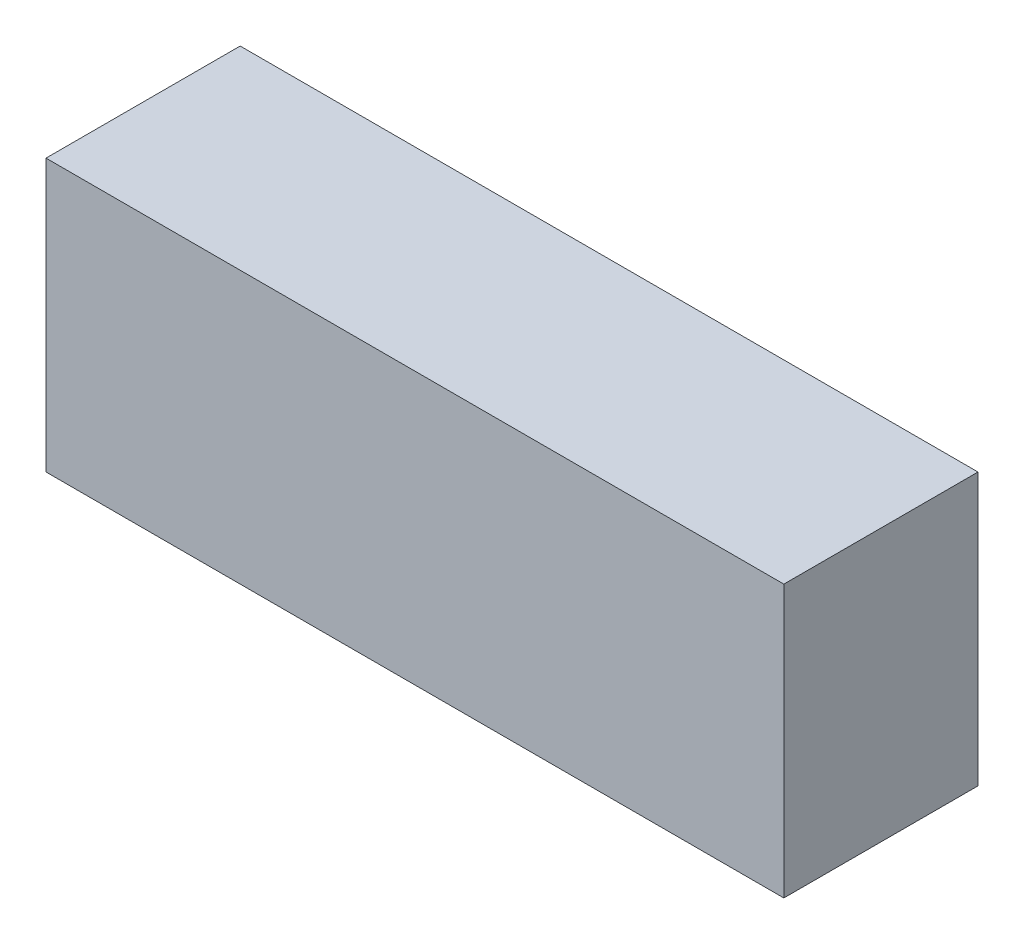
ISO-10303-21;
HEADER;
FILE_DESCRIPTION(('STEP AP214'),'2;1');
FILE_NAME('part.step','',(''),(''),'','','');
FILE_SCHEMA(('AUTOMOTIVE_DESIGN { 1 0 10303 214 1 1 1 1 }'));
ENDSEC;
DATA;
#1=APPLICATION_CONTEXT('core data for automotive mechanical design processes');
#2=APPLICATION_PROTOCOL_DEFINITION('international standard','automotive_design',2000,#1);
#3=PRODUCT_CONTEXT('',#1,'mechanical');
#4=PRODUCT('Part','Part','',(#3));
#5=PRODUCT_RELATED_PRODUCT_CATEGORY('part','',(#4));
#6=PRODUCT_DEFINITION_FORMATION('','',#4);
#7=PRODUCT_DEFINITION_CONTEXT('part definition',#1,'design');
#8=PRODUCT_DEFINITION('design','',#6,#7);
#9=PRODUCT_DEFINITION_SHAPE('','',#8);
#10=(LENGTH_UNIT() NAMED_UNIT(*) SI_UNIT(.MILLI.,.METRE.));
#11=(NAMED_UNIT(*) PLANE_ANGLE_UNIT() SI_UNIT($,.RADIAN.));
#12=(NAMED_UNIT(*) SI_UNIT($,.STERADIAN.) SOLID_ANGLE_UNIT());
#13=UNCERTAINTY_MEASURE_WITH_UNIT(LENGTH_MEASURE(1.E-05),#10,'distance_accuracy_value','');
#14=(GEOMETRIC_REPRESENTATION_CONTEXT(3) GLOBAL_UNCERTAINTY_ASSIGNED_CONTEXT((#13)) GLOBAL_UNIT_ASSIGNED_CONTEXT((#10,
#11,#12)) REPRESENTATION_CONTEXT('',''));
#15=CARTESIAN_POINT('',(0.,0.,0.));
#16=DIRECTION('',(0.,0.,1.));
#17=DIRECTION('',(1.,0.,0.));
#18=AXIS2_PLACEMENT_3D('',#15,#16,#17);
#19=CARTESIAN_POINT('',(0.,0.,0.));
#20=DIRECTION('',(0.,0.,1.));
#21=DIRECTION('',(1.,0.,0.));
#22=AXIS2_PLACEMENT_3D('',#19,#20,#21);
#23=PLANE('',#22);
#24=DIRECTION('',(0.,-1.,0.));
#25=VECTOR('',#24,1.);
#26=CARTESIAN_POINT('',(0.,0.,0.));
#27=LINE('',#26,#25);
#28=CARTESIAN_POINT('',(0.,0.,0.));
#29=VERTEX_POINT('',#28);
#30=CARTESIAN_POINT('',(0.,-700.,0.));
#31=VERTEX_POINT('',#30);
#32=EDGE_CURVE('E278',#29,#31,#27,.T.);
#33=ORIENTED_EDGE('',*,*,#32,.F.);
#34=DIRECTION('',(-1.,0.,0.));
#35=VECTOR('',#34,1.);
#36=CARTESIAN_POINT('',(0.,0.,0.));
#37=LINE('',#36,#35);
#38=CARTESIAN_POINT('',(1900.,2.32682891837997E-13,0.));
#39=VERTEX_POINT('',#38);
#40=EDGE_CURVE('E83',#39,#29,#37,.T.);
#41=ORIENTED_EDGE('',*,*,#40,.F.);
#42=DIRECTION('',(0.,1.,0.));
#43=VECTOR('',#42,1.);
#44=CARTESIAN_POINT('',(1900.,2.32682891837997E-13,0.));
#45=LINE('',#44,#43);
#46=CARTESIAN_POINT('',(1900.,-700.,0.));
#47=VERTEX_POINT('',#46);
#48=EDGE_CURVE('E283',#47,#39,#45,.T.);
#49=ORIENTED_EDGE('',*,*,#48,.F.);
#50=DIRECTION('',(1.,0.,0.));
#51=VECTOR('',#50,1.);
#52=CARTESIAN_POINT('',(0.,-700.,0.));
#53=LINE('',#52,#51);
#54=EDGE_CURVE('E281',#31,#47,#53,.T.);
#55=ORIENTED_EDGE('',*,*,#54,.F.);
#56=EDGE_LOOP('',(#33,#41,#49,#55));
#57=FACE_BOUND('',#56,.T.);
#58=DIRECTION('',(-0.866025403784438,0.500000000000001,0.));
#59=VECTOR('',#58,1.);
#60=CARTESIAN_POINT('',(12.5474196215564,21.7327682884223,0.));
#61=LINE('',#60,#59);
#62=CARTESIAN_POINT('',(477.0922463406,-246.472312468466,0.));
#63=VERTEX_POINT('',#62);
#64=CARTESIAN_POINT('',(412.140341056767,-208.972312468466,0.));
#65=VERTEX_POINT('',#64);
#66=EDGE_CURVE('E11',#63,#65,#61,.T.);
#67=ORIENTED_EDGE('',*,*,#66,.F.);
#68=CARTESIAN_POINT('',(477.0922463406,-246.472312468466,0.));
#69=CARTESIAN_POINT('',(477.824289258308,-246.894957644063,0.));
#70=CARTESIAN_POINT('',(479.288375093724,-247.740247995257,0.));
#71=CARTESIAN_POINT('',(481.552545630475,-248.863428405583,0.));
#72=CARTESIAN_POINT('',(483.952799734478,-249.697098582978,0.));
#73=CARTESIAN_POINT('',(485.689052704399,-249.963368468311,0.));
#74=CARTESIAN_POINT('',(486.602540378444,-250.,0.));
#75=B_SPLINE_CURVE_WITH_KNOTS('',3,(#68,#69,#70,#71,#72,#73,#74),.UNSPECIFIED.,.F.,.F.,(4,1,1,1,
4),(0.,0.25,0.5,0.75,1.),.UNSPECIFIED.);
#76=CARTESIAN_POINT('',(486.602540378444,-250.,0.));
#77=VERTEX_POINT('',#76);
#78=EDGE_CURVE('E127',#77,#63,#75,.F.);
#79=ORIENTED_EDGE('',*,*,#78,.F.);
#80=CARTESIAN_POINT('',(478.792326340599,-243.527687531534,0.));
#81=CARTESIAN_POINT('',(479.524369258308,-243.950332707131,0.));
#82=CARTESIAN_POINT('',(480.988455093724,-244.795623058326,0.));
#83=CARTESIAN_POINT('',(483.093243130475,-246.194862056489,0.));
#84=CARTESIAN_POINT('',(485.015349734478,-247.856707997396,0.));
#85=CARTESIAN_POINT('',(486.114072704399,-249.227212234078,0.));
#86=CARTESIAN_POINT('',(486.602540378444,-250.,0.));
#87=B_SPLINE_CURVE_WITH_KNOTS('',3,(#80,#81,#82,#83,#84,#85,#86),.UNSPECIFIED.,.F.,.F.,(4,1,1,1,
4),(0.,0.25,0.5,0.75,1.),.UNSPECIFIED.);
#88=CARTESIAN_POINT('',(478.792326340599,-243.527687531534,0.));
#89=VERTEX_POINT('',#88);
#90=EDGE_CURVE('E142',#77,#89,#87,.F.);
#91=ORIENTED_EDGE('',*,*,#90,.T.);
#92=DIRECTION('',(0.866025403784438,-0.500000000000001,0.));
#93=VECTOR('',#92,1.);
#94=CARTESIAN_POINT('',(14.2474996215564,24.677393225354,0.));
#95=LINE('',#94,#93);
#96=CARTESIAN_POINT('',(413.840421056767,-206.027687531534,0.));
#97=VERTEX_POINT('',#96);
#98=EDGE_CURVE('E46',#97,#89,#95,.T.);
#99=ORIENTED_EDGE('',*,*,#98,.F.);
#100=CARTESIAN_POINT('',(413.840421056767,-206.027687531534,0.));
#101=CARTESIAN_POINT('',(413.622528560335,-205.901887240065,0.));
#102=CARTESIAN_POINT('',(409.264678631696,-203.385881410677,0.));
#103=CARTESIAN_POINT('',(400.724202629113,-198.745644251402,0.));
#104=CARTESIAN_POINT('',(400.,-200.,0.));
#105=B_SPLINE_CURVE_WITH_KNOTS('',3,(#100,#101,#102,#103,#104),.UNSPECIFIED.,.F.,.F.,(4,1,4),
(0.,0.0500000000000003,1.),.UNSPECIFIED.);
#106=CARTESIAN_POINT('',(400.,-200.,0.));
#107=VERTEX_POINT('',#106);
#108=EDGE_CURVE('E131',#97,#107,#105,.T.);
#109=ORIENTED_EDGE('',*,*,#108,.T.);
#110=CARTESIAN_POINT('',(412.140341056767,-208.972312468466,0.));
#111=CARTESIAN_POINT('',(411.922448560335,-208.846512176996,0.));
#112=CARTESIAN_POINT('',(407.564598631696,-206.330506347609,0.));
#113=CARTESIAN_POINT('',(399.275797370888,-201.254355748598,0.));
#114=CARTESIAN_POINT('',(400.,-200.,0.));
#115=B_SPLINE_CURVE_WITH_KNOTS('',3,(#110,#111,#112,#113,#114),.UNSPECIFIED.,.F.,.F.,(4,1,4),
(0.,0.0500000000000003,1.),.UNSPECIFIED.);
#116=EDGE_CURVE('E116',#65,#107,#115,.T.);
#117=ORIENTED_EDGE('',*,*,#116,.F.);
#118=EDGE_LOOP('',(#67,#79,#91,#99,#109,#117));
#119=FACE_BOUND('',#118,.T.);
#120=ADVANCED_FACE('F37',(#57,#119),#23,.F.);
#121=CARTESIAN_POINT('',(0.,0.,500.));
#122=DIRECTION('',(1.,0.,0.));
#123=DIRECTION('',(0.,0.,-1.));
#124=AXIS2_PLACEMENT_3D('',#121,#122,#123);
#125=PLANE('',#124);
#126=ORIENTED_EDGE('',*,*,#32,.T.);
#127=DIRECTION('',(0.,0.,-1.));
#128=VECTOR('',#127,1.);
#129=CARTESIAN_POINT('',(0.,-700.,500.));
#130=LINE('',#129,#128);
#131=CARTESIAN_POINT('',(0.,-700.,500.));
#132=VERTEX_POINT('',#131);
#133=EDGE_CURVE('E292',#132,#31,#130,.T.);
#134=ORIENTED_EDGE('',*,*,#133,.F.);
#135=DIRECTION('',(0.,-1.,0.));
#136=VECTOR('',#135,1.);
#137=CARTESIAN_POINT('',(0.,0.,500.));
#138=LINE('',#137,#136);
#139=CARTESIAN_POINT('',(0.,0.,500.));
#140=VERTEX_POINT('',#139);
#141=EDGE_CURVE('E271',#140,#132,#138,.T.);
#142=ORIENTED_EDGE('',*,*,#141,.F.);
#143=DIRECTION('',(0.,0.,-1.));
#144=VECTOR('',#143,1.);
#145=CARTESIAN_POINT('',(0.,0.,500.));
#146=LINE('',#145,#144);
#147=EDGE_CURVE('E277',#140,#29,#146,.T.);
#148=ORIENTED_EDGE('',*,*,#147,.T.);
#149=EDGE_LOOP('',(#126,#134,#142,#148));
#150=FACE_BOUND('',#149,.T.);
#151=ADVANCED_FACE('F39',(#150),#125,.F.);
#152=CARTESIAN_POINT('',(0.,-700.,500.));
#153=DIRECTION('',(0.,1.,0.));
#154=DIRECTION('',(-1.,0.,0.));
#155=AXIS2_PLACEMENT_3D('',#152,#153,#154);
#156=PLANE('',#155);
#157=ORIENTED_EDGE('',*,*,#54,.T.);
#158=DIRECTION('',(0.,0.,-1.));
#159=VECTOR('',#158,1.);
#160=CARTESIAN_POINT('',(1900.,-700.,500.));
#161=LINE('',#160,#159);
#162=CARTESIAN_POINT('',(1900.,-700.,500.));
#163=VERTEX_POINT('',#162);
#164=EDGE_CURVE('E289',#163,#47,#161,.T.);
#165=ORIENTED_EDGE('',*,*,#164,.F.);
#166=DIRECTION('',(1.,0.,0.));
#167=VECTOR('',#166,1.);
#168=CARTESIAN_POINT('',(0.,-700.,500.));
#169=LINE('',#168,#167);
#170=EDGE_CURVE('E91',#132,#163,#169,.T.);
#171=ORIENTED_EDGE('',*,*,#170,.F.);
#172=ORIENTED_EDGE('',*,*,#133,.T.);
#173=EDGE_LOOP('',(#157,#165,#171,#172));
#174=FACE_BOUND('',#173,.T.);
#175=ADVANCED_FACE('F373',(#174),#156,.F.);
#176=CARTESIAN_POINT('',(1900.,2.32682891837997E-13,500.));
#177=DIRECTION('',(-1.,0.,0.));
#178=DIRECTION('',(0.,0.,1.));
#179=AXIS2_PLACEMENT_3D('',#176,#177,#178);
#180=PLANE('',#179);
#181=ORIENTED_EDGE('',*,*,#48,.T.);
#182=DIRECTION('',(0.,0.,-1.));
#183=VECTOR('',#182,1.);
#184=CARTESIAN_POINT('',(1900.,2.32682891837997E-13,500.));
#185=LINE('',#184,#183);
#186=CARTESIAN_POINT('',(1900.,2.32682891837997E-13,500.));
#187=VERTEX_POINT('',#186);
#188=EDGE_CURVE('E287',#187,#39,#185,.T.);
#189=ORIENTED_EDGE('',*,*,#188,.F.);
#190=DIRECTION('',(0.,1.,0.));
#191=VECTOR('',#190,1.);
#192=CARTESIAN_POINT('',(1900.,2.32682891837997E-13,500.));
#193=LINE('',#192,#191);
#194=EDGE_CURVE('E274',#163,#187,#193,.T.);
#195=ORIENTED_EDGE('',*,*,#194,.F.);
#196=ORIENTED_EDGE('',*,*,#164,.T.);
#197=EDGE_LOOP('',(#181,#189,#195,#196));
#198=FACE_BOUND('',#197,.T.);
#199=ADVANCED_FACE('F380',(#198),#180,.F.);
#200=CARTESIAN_POINT('',(0.,0.,500.));
#201=DIRECTION('',(0.,-1.,0.));
#202=DIRECTION('',(1.,0.,0.));
#203=AXIS2_PLACEMENT_3D('',#200,#201,#202);
#204=PLANE('',#203);
#205=ORIENTED_EDGE('',*,*,#40,.T.);
#206=ORIENTED_EDGE('',*,*,#147,.F.);
#207=DIRECTION('',(-1.,0.,0.));
#208=VECTOR('',#207,1.);
#209=CARTESIAN_POINT('',(0.,0.,500.));
#210=LINE('',#209,#208);
#211=EDGE_CURVE('E62',#187,#140,#210,.T.);
#212=ORIENTED_EDGE('',*,*,#211,.F.);
#213=ORIENTED_EDGE('',*,*,#188,.T.);
#214=EDGE_LOOP('',(#205,#206,#212,#213));
#215=FACE_BOUND('',#214,.T.);
#216=ADVANCED_FACE('F377',(#215),#204,.F.);
#217=CARTESIAN_POINT('',(0.,0.,500.));
#218=DIRECTION('',(0.,0.,1.));
#219=DIRECTION('',(1.,0.,0.));
#220=AXIS2_PLACEMENT_3D('',#217,#218,#219);
#221=PLANE('',#220);
#222=ORIENTED_EDGE('',*,*,#141,.T.);
#223=ORIENTED_EDGE('',*,*,#170,.T.);
#224=ORIENTED_EDGE('',*,*,#194,.T.);
#225=ORIENTED_EDGE('',*,*,#211,.T.);
#226=EDGE_LOOP('',(#222,#223,#224,#225));
#227=FACE_BOUND('',#226,.T.);
#228=ADVANCED_FACE('F364',(#227),#221,.T.);
#229=CARTESIAN_POINT('',(400.85004,-198.527687531534,0.));
#230=DIRECTION('',(-0.500000000000001,-0.866025403784438,0.));
#231=DIRECTION('',(0.866025403784438,-0.500000000000001,0.));
#232=AXIS2_PLACEMENT_3D('',#229,#230,#231);
#233=PLANE('',#232);
#234=ORIENTED_EDGE('',*,*,#98,.T.);
#235=DIRECTION('',(0.,0.,1.));
#236=VECTOR('',#235,1.);
#237=CARTESIAN_POINT('',(478.792326340599,-243.527687531534,18.1702141807132));
#238=LINE('',#237,#236);
#239=CARTESIAN_POINT('',(478.792326340599,-243.527687531534,36.3404283614264));
#240=VERTEX_POINT('',#239);
#241=EDGE_CURVE('E229',#89,#240,#238,.T.);
#242=ORIENTED_EDGE('',*,*,#241,.T.);
#243=DIRECTION('',(-0.779356523652348,0.449961698725375,-0.436048023411072));
#244=VECTOR('',#243,1.);
#245=CARTESIAN_POINT('',(446.316373698683,-224.777687531534,18.1702141807132));
#246=LINE('',#245,#244);
#247=EDGE_CURVE('E168',#240,#97,#246,.T.);
#248=ORIENTED_EDGE('',*,*,#247,.T.);
#249=EDGE_LOOP('',(#234,#242,#248));
#250=FACE_BOUND('',#249,.T.);
#251=ADVANCED_FACE('F251',(#250),#233,.T.);
#252=CARTESIAN_POINT('',(399.14996,-201.472312468466,0.));
#253=DIRECTION('',(0.500000000000001,0.866025403784438,0.));
#254=DIRECTION('',(0.866025403784438,-0.500000000000001,0.));
#255=AXIS2_PLACEMENT_3D('',#252,#253,#254);
#256=PLANE('',#255);
#257=ORIENTED_EDGE('',*,*,#66,.T.);
#258=DIRECTION('',(-0.779356523652348,0.449961698725375,-0.436048023411072));
#259=VECTOR('',#258,1.);
#260=CARTESIAN_POINT('',(444.616293698683,-227.722312468466,18.1702141807132));
#261=LINE('',#260,#259);
#262=CARTESIAN_POINT('',(477.0922463406,-246.472312468466,36.3404283614264));
#263=VERTEX_POINT('',#262);
#264=EDGE_CURVE('E122',#263,#65,#261,.T.);
#265=ORIENTED_EDGE('',*,*,#264,.F.);
#266=DIRECTION('',(0.,0.,1.));
#267=VECTOR('',#266,1.);
#268=CARTESIAN_POINT('',(477.0922463406,-246.472312468466,18.1702141807132));
#269=LINE('',#268,#267);
#270=EDGE_CURVE('E177',#63,#263,#269,.T.);
#271=ORIENTED_EDGE('',*,*,#270,.F.);
#272=EDGE_LOOP('',(#257,#265,#271));
#273=FACE_BOUND('',#272,.T.);
#274=ADVANCED_FACE('F201',(#273),#256,.T.);
#275=CARTESIAN_POINT('',(413.840421056767,-206.027687531534,0.));
#276=CARTESIAN_POINT('',(435.491056151378,-218.527687531534,12.1134761204755));
#277=CARTESIAN_POINT('',(457.141691245989,-231.027687531534,24.226952240951));
#278=CARTESIAN_POINT('',(478.792326340599,-243.527687531534,36.3404283614264));
#279=CARTESIAN_POINT('',(413.622528560335,-205.901887240065,0.));
#280=CARTESIAN_POINT('',(435.392504326038,-218.470788608645,12.1778442477488));
#281=CARTESIAN_POINT('',(457.162573605312,-231.039743967311,24.3630565973957));
#282=CARTESIAN_POINT('',(478.937506833168,-243.611507527999,36.5434986665467));
#283=CARTESIAN_POINT('',(409.264678631696,-203.385881410677,0.));
#284=CARTESIAN_POINT('',(433.424835136397,-217.33475427233,13.4718507420828));
#285=CARTESIAN_POINT('',(457.586768398935,-231.284652945598,27.0836954202283));
#286=CARTESIAN_POINT('',(481.841116684532,-245.287907457306,40.6049047689522));
#287=CARTESIAN_POINT('',(400.724202629113,-198.745644251402,0.));
#288=CARTESIAN_POINT('',(429.631071803028,-215.3441448211,16.1513014939673));
#289=CARTESIAN_POINT('',(458.537940976944,-231.942645390798,32.3026029879346));
#290=CARTESIAN_POINT('',(487.44481015086,-248.541145960496,48.4539044819019));
#291=CARTESIAN_POINT('',(400.,-200.,0.));
#292=CARTESIAN_POINT('',(428.867513459481,-216.666666666667,16.1513014939673));
#293=CARTESIAN_POINT('',(457.735026918963,-233.333333333333,32.3026029879346));
#294=CARTESIAN_POINT('',(486.602540378444,-250.,48.4539044819019));
#295=B_SPLINE_SURFACE_WITH_KNOTS('',3,3,((#275,#276,#277,#278),(#279,#280,#281,#282),(#283,#284,
#285,#286),(#287,#288,#289,#290),(#291,#292,#293,#294)),.UNSPECIFIED.,.F.,.F.,.F.,(4,1,4),(4,4),
(0.,0.0500000000000003,1.),(0.,1.),.UNSPECIFIED.);
#296=CARTESIAN_POINT('',(478.792326340599,-243.527687531534,36.3404283614264));
#297=CARTESIAN_POINT('',(478.937506833168,-243.611507527999,36.5434986665467));
#298=CARTESIAN_POINT('',(481.841116684532,-245.287907457306,40.6049047689522));
#299=CARTESIAN_POINT('',(487.44481015086,-248.541145960496,48.4539044819019));
#300=CARTESIAN_POINT('',(486.602540378444,-250.,48.4539044819019));
#301=B_SPLINE_CURVE_WITH_KNOTS('',3,(#296,#297,#298,#299,#300),.UNSPECIFIED.,.F.,.F.,(4,1,4),
(0.,0.0500000000000003,1.),.UNSPECIFIED.);
#302=CARTESIAN_POINT('',(486.602540378444,-250.,48.4539044819019));
#303=VERTEX_POINT('',#302);
#304=EDGE_CURVE('E134',#240,#303,#301,.T.);
#305=DIRECTION('',(0.779356523652348,-0.449961698725375,0.436048023411072));
#306=VECTOR('',#305,1.);
#307=CARTESIAN_POINT('',(400.,-200.,0.));
#308=LINE('',#307,#306);
#309=EDGE_CURVE('E119',#107,#303,#308,.T.);
#310=ORIENTED_EDGE('',*,*,#108,.F.);
#311=ORIENTED_EDGE('',*,*,#247,.F.);
#312=ORIENTED_EDGE('',*,*,#304,.T.);
#313=ORIENTED_EDGE('',*,*,#309,.F.);
#314=EDGE_LOOP('',(#310,#311,#312,#313));
#315=FACE_BOUND('',#314,.T.);
#316=ADVANCED_FACE('F130',(#315),#295,.F.);
#317=CARTESIAN_POINT('',(478.792326340599,-243.527687531534,36.3404283614264));
#318=CARTESIAN_POINT('',(478.792326340599,-243.527687531534,24.2269522409509));
#319=CARTESIAN_POINT('',(478.792326340599,-243.527687531534,12.1134761204755));
#320=CARTESIAN_POINT('',(478.792326340599,-243.527687531534,0.));
#321=CARTESIAN_POINT('',(479.518228803441,-243.946787513861,37.3557798870278));
#322=CARTESIAN_POINT('',(479.52027562173,-243.947969244951,24.9038532580185));
#323=CARTESIAN_POINT('',(479.522322440019,-243.949150976041,12.4519266290093));
#324=CARTESIAN_POINT('',(479.524369258308,-243.950332707131,0.));
#325=CARTESIAN_POINT('',(481.241444010881,-244.93375593131,39.7613131676455));
#326=CARTESIAN_POINT('',(481.157114371829,-244.887711640315,26.5075421117637));
#327=CARTESIAN_POINT('',(481.072784732776,-244.84166734932,13.2537710558818));
#328=CARTESIAN_POINT('',(480.988455093724,-244.795623058326,0.));
#329=CARTESIAN_POINT('',(484.182316355827,-246.790942444412,43.9713074780562));
#330=CARTESIAN_POINT('',(483.819291947376,-246.592248981771,29.3142049853708));
#331=CARTESIAN_POINT('',(483.456267538925,-246.39355551913,14.6571024926854));
#332=CARTESIAN_POINT('',(483.093243130475,-246.194862056489,0.));
#333=CARTESIAN_POINT('',(486.410603683973,-248.620682885435,47.4171355480387));
#334=CARTESIAN_POINT('',(485.945519034142,-248.366024589422,31.6114236986925));
#335=CARTESIAN_POINT('',(485.48043438431,-248.111366293409,15.8057118493462));
#336=CARTESIAN_POINT('',(485.015349734478,-247.856707997396,0.));
#337=CARTESIAN_POINT('',(486.824190318553,-249.616091042236,48.4539044819019));
#338=CARTESIAN_POINT('',(486.587484447169,-249.48646477285,32.3026029879346));
#339=CARTESIAN_POINT('',(486.350778575784,-249.356838503464,16.1513014939673));
#340=CARTESIAN_POINT('',(486.114072704399,-249.227212234078,0.));
#341=CARTESIAN_POINT('',(486.602540378444,-250.,48.4539044819019));
#342=CARTESIAN_POINT('',(486.602540378444,-250.,32.3026029879346));
#343=CARTESIAN_POINT('',(486.602540378444,-250.,16.1513014939673));
#344=CARTESIAN_POINT('',(486.602540378444,-250.,0.));
#345=B_SPLINE_SURFACE_WITH_KNOTS('',3,3,((#317,#318,#319,#320),(#321,#322,#323,#324),(#325,#326,
#327,#328),(#329,#330,#331,#332),(#333,#334,#335,#336),(#337,#338,#339,#340),(#341,#342,#343,
#344)),.UNSPECIFIED.,.F.,.F.,.F.,(4,1,1,1,4),(4,4),(0.,0.25,0.5,0.75,1.),(0.,1.),.UNSPECIFIED.);
#346=DIRECTION('',(0.,0.,-1.));
#347=VECTOR('',#346,1.);
#348=CARTESIAN_POINT('',(486.602540378444,-250.,48.4539044819019));
#349=LINE('',#348,#347);
#350=EDGE_CURVE('E53',#303,#77,#349,.T.);
#351=ORIENTED_EDGE('',*,*,#304,.F.);
#352=ORIENTED_EDGE('',*,*,#241,.F.);
#353=ORIENTED_EDGE('',*,*,#90,.F.);
#354=ORIENTED_EDGE('',*,*,#350,.F.);
#355=EDGE_LOOP('',(#351,#352,#353,#354));
#356=FACE_BOUND('',#355,.T.);
#357=ADVANCED_FACE('F200',(#356),#345,.F.);
#358=CARTESIAN_POINT('',(412.140341056767,-208.972312468466,0.));
#359=CARTESIAN_POINT('',(433.790976151378,-221.472312468466,12.1134761204755));
#360=CARTESIAN_POINT('',(455.441611245989,-233.972312468466,24.226952240951));
#361=CARTESIAN_POINT('',(477.0922463406,-246.472312468466,36.3404283614264));
#362=CARTESIAN_POINT('',(411.922448560335,-208.846512176996,0.));
#363=CARTESIAN_POINT('',(433.692424326038,-221.415413545577,12.1778442477488));
#364=CARTESIAN_POINT('',(455.462493605312,-233.984368904242,24.3630565973957));
#365=CARTESIAN_POINT('',(477.237426833168,-246.556132464931,36.5434986665467));
#366=CARTESIAN_POINT('',(407.564598631696,-206.330506347609,0.));
#367=CARTESIAN_POINT('',(431.724755136397,-220.279379209261,13.4718507420828));
#368=CARTESIAN_POINT('',(455.886688398935,-234.229277882529,27.0836954202283));
#369=CARTESIAN_POINT('',(480.141036684532,-248.232532394238,40.6049047689522));
#370=CARTESIAN_POINT('',(399.275797370888,-201.254355748598,0.));
#371=CARTESIAN_POINT('',(428.103955115934,-217.989188512233,16.1513014939673));
#372=CARTESIAN_POINT('',(456.932112860981,-234.724021275869,32.3026029879346));
#373=CARTESIAN_POINT('',(485.760270606028,-251.458854039504,48.4539044819019));
#374=CARTESIAN_POINT('',(400.,-200.,0.));
#375=CARTESIAN_POINT('',(428.867513459481,-216.666666666667,16.1513014939673));
#376=CARTESIAN_POINT('',(457.735026918963,-233.333333333333,32.3026029879346));
#377=CARTESIAN_POINT('',(486.602540378444,-250.,48.4539044819019));
#378=B_SPLINE_SURFACE_WITH_KNOTS('',3,3,((#358,#359,#360,#361),(#362,#363,#364,#365),(#366,#367,
#368,#369),(#370,#371,#372,#373),(#374,#375,#376,#377)),.UNSPECIFIED.,.F.,.F.,.F.,(4,1,4),(4,4),
(0.,0.0500000000000003,1.),(0.,1.),.UNSPECIFIED.);
#379=CARTESIAN_POINT('',(477.0922463406,-246.472312468466,36.3404283614264));
#380=CARTESIAN_POINT('',(477.818148803441,-246.891412450793,37.3557798870278));
#381=CARTESIAN_POINT('',(479.534496129405,-247.890276387899,39.7613131676455));
#382=CARTESIAN_POINT('',(482.61330300179,-249.508553291359,43.9713074780562));
#383=CARTESIAN_POINT('',(485.31204837012,-250.523436503953,47.4171355480387));
#384=CARTESIAN_POINT('',(486.380890438334,-250.383908957764,48.4539044819019));
#385=CARTESIAN_POINT('',(486.602540378444,-250.,48.4539044819019));
#386=B_SPLINE_CURVE_WITH_KNOTS('',3,(#379,#380,#381,#382,#383,#384,#385),.UNSPECIFIED.,.F.,.F.,
(4,1,1,1,4),(0.,0.25,0.5,0.75,1.),.UNSPECIFIED.);
#387=EDGE_CURVE('E137',#263,#303,#386,.T.);
#388=ORIENTED_EDGE('',*,*,#116,.T.);
#389=ORIENTED_EDGE('',*,*,#309,.T.);
#390=ORIENTED_EDGE('',*,*,#387,.F.);
#391=ORIENTED_EDGE('',*,*,#264,.T.);
#392=EDGE_LOOP('',(#388,#389,#390,#391));
#393=FACE_BOUND('',#392,.T.);
#394=ADVANCED_FACE('F118',(#393),#378,.T.);
#395=CARTESIAN_POINT('',(477.0922463406,-246.472312468466,36.3404283614264));
#396=CARTESIAN_POINT('',(477.0922463406,-246.472312468466,24.2269522409509));
#397=CARTESIAN_POINT('',(477.0922463406,-246.472312468466,12.1134761204755));
#398=CARTESIAN_POINT('',(477.0922463406,-246.472312468466,0.));
#399=CARTESIAN_POINT('',(477.818148803441,-246.891412450793,37.3557798870278));
#400=CARTESIAN_POINT('',(477.82019562173,-246.892594181883,24.9038532580185));
#401=CARTESIAN_POINT('',(477.822242440019,-246.893775912973,12.4519266290093));
#402=CARTESIAN_POINT('',(477.824289258308,-246.894957644063,0.));
#403=CARTESIAN_POINT('',(479.534496129405,-247.890276387899,39.7613131676455));
#404=CARTESIAN_POINT('',(479.452455784178,-247.840266923685,26.5075421117637));
#405=CARTESIAN_POINT('',(479.370415438951,-247.790257459471,13.2537710558818));
#406=CARTESIAN_POINT('',(479.288375093724,-247.740247995257,0.));
#407=CARTESIAN_POINT('',(482.61330300179,-249.508553291359,43.9713074780562));
#408=CARTESIAN_POINT('',(482.259717211352,-249.293511662767,29.3142049853708));
#409=CARTESIAN_POINT('',(481.906131420913,-249.078470034175,14.6571024926854));
#410=CARTESIAN_POINT('',(481.552545630475,-248.863428405583,0.));
#411=CARTESIAN_POINT('',(485.31204837012,-250.523436503953,47.4171355480387));
#412=CARTESIAN_POINT('',(484.858965491573,-250.247990530295,31.6114236986925));
#413=CARTESIAN_POINT('',(484.405882613025,-249.972544556637,15.8057118493462));
#414=CARTESIAN_POINT('',(483.952799734478,-249.697098582978,0.));
#415=CARTESIAN_POINT('',(486.380890438334,-250.383908957764,48.4539044819019));
#416=CARTESIAN_POINT('',(486.150277860356,-250.243728794613,32.3026029879346));
#417=CARTESIAN_POINT('',(485.919665282377,-250.103548631462,16.1513014939673));
#418=CARTESIAN_POINT('',(485.689052704399,-249.963368468311,0.));
#419=CARTESIAN_POINT('',(486.602540378444,-250.,48.4539044819019));
#420=CARTESIAN_POINT('',(486.602540378444,-250.,32.3026029879346));
#421=CARTESIAN_POINT('',(486.602540378444,-250.,16.1513014939673));
#422=CARTESIAN_POINT('',(486.602540378444,-250.,0.));
#423=B_SPLINE_SURFACE_WITH_KNOTS('',3,3,((#395,#396,#397,#398),(#399,#400,#401,#402),(#403,#404,
#405,#406),(#407,#408,#409,#410),(#411,#412,#413,#414),(#415,#416,#417,#418),(#419,#420,#421,
#422)),.UNSPECIFIED.,.F.,.F.,.F.,(4,1,1,1,4),(4,4),(0.,0.25,0.5,0.75,1.),(0.,1.),.UNSPECIFIED.);
#424=ORIENTED_EDGE('',*,*,#387,.T.);
#425=ORIENTED_EDGE('',*,*,#350,.T.);
#426=ORIENTED_EDGE('',*,*,#78,.T.);
#427=ORIENTED_EDGE('',*,*,#270,.T.);
#428=EDGE_LOOP('',(#424,#425,#426,#427));
#429=FACE_BOUND('',#428,.T.);
#430=ADVANCED_FACE('F179',(#429),#423,.T.);
#431=CLOSED_SHELL('',(#120,#151,#175,#199,#216,#228,#251,#274,#316,#357,#394,#430));
#432=MANIFOLD_SOLID_BREP('B2',#431);
#433=ADVANCED_BREP_SHAPE_REPRESENTATION('',(#18,#432),#14);
#434=SHAPE_DEFINITION_REPRESENTATION(#9,#433);
ENDSEC;
END-ISO-10303-21;
